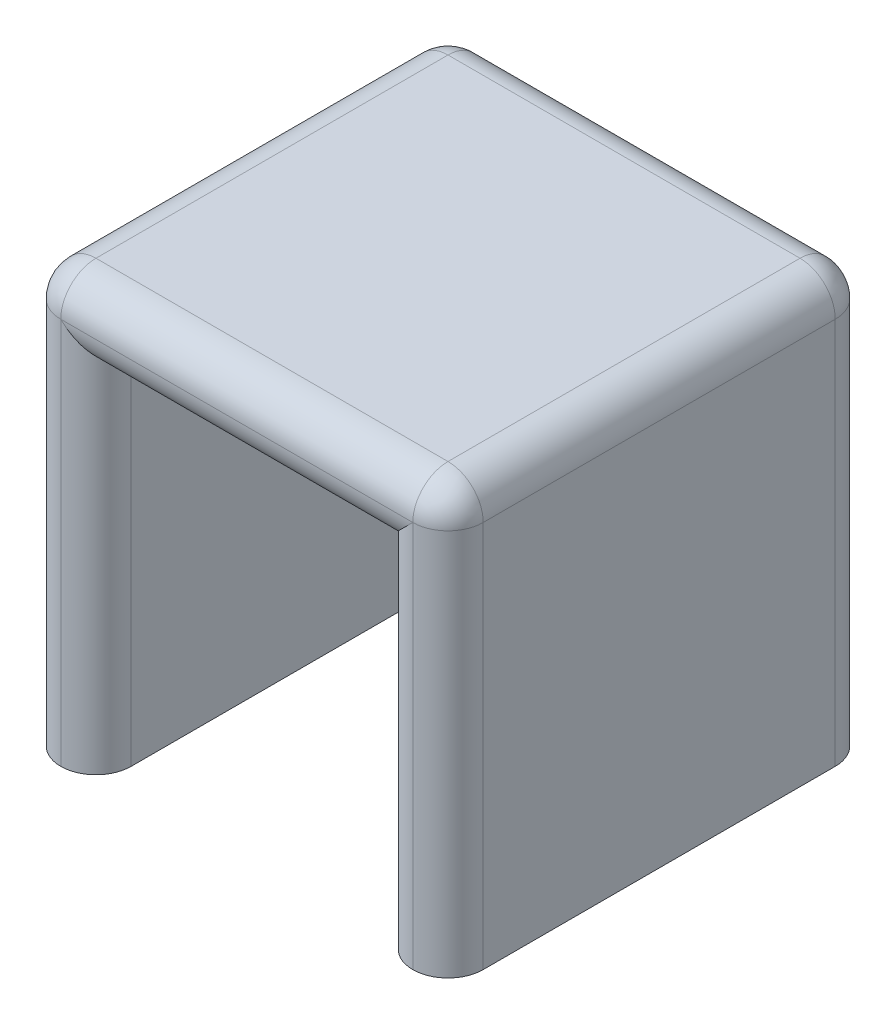
ISO-10303-21;
HEADER;
FILE_DESCRIPTION(('STEP AP214'),'2;1');
FILE_NAME('part.step','',(''),(''),'','','');
FILE_SCHEMA(('AUTOMOTIVE_DESIGN { 1 0 10303 214 1 1 1 1 }'));
ENDSEC;
DATA;
#1=APPLICATION_CONTEXT('core data for automotive mechanical design processes');
#2=APPLICATION_PROTOCOL_DEFINITION('international standard','automotive_design',2000,#1);
#3=PRODUCT_CONTEXT('',#1,'mechanical');
#4=PRODUCT('Part','Part','',(#3));
#5=PRODUCT_RELATED_PRODUCT_CATEGORY('part','',(#4));
#6=PRODUCT_DEFINITION_FORMATION('','',#4);
#7=PRODUCT_DEFINITION_CONTEXT('part definition',#1,'design');
#8=PRODUCT_DEFINITION('design','',#6,#7);
#9=PRODUCT_DEFINITION_SHAPE('','',#8);
#10=(LENGTH_UNIT() NAMED_UNIT(*) SI_UNIT(.MILLI.,.METRE.));
#11=(NAMED_UNIT(*) PLANE_ANGLE_UNIT() SI_UNIT($,.RADIAN.));
#12=(NAMED_UNIT(*) SI_UNIT($,.STERADIAN.) SOLID_ANGLE_UNIT());
#13=UNCERTAINTY_MEASURE_WITH_UNIT(LENGTH_MEASURE(1.E-05),#10,'distance_accuracy_value','');
#14=(GEOMETRIC_REPRESENTATION_CONTEXT(3) GLOBAL_UNCERTAINTY_ASSIGNED_CONTEXT((#13)) GLOBAL_UNIT_ASSIGNED_CONTEXT((#10,
#11,#12)) REPRESENTATION_CONTEXT('',''));
#15=CARTESIAN_POINT('',(0.,0.,0.));
#16=DIRECTION('',(0.,0.,1.));
#17=DIRECTION('',(1.,0.,0.));
#18=AXIS2_PLACEMENT_3D('',#15,#16,#17);
#19=CARTESIAN_POINT('',(2.,0.,12.));
#20=DIRECTION('',(0.,1.,0.));
#21=DIRECTION('',(0.,0.,1.));
#22=AXIS2_PLACEMENT_3D('',#19,#20,#21);
#23=PLANE('',#22);
#24=DIRECTION('',(0.,0.,-1.));
#25=VECTOR('',#24,1.);
#26=CARTESIAN_POINT('',(2.,0.,12.));
#27=LINE('',#26,#25);
#28=CARTESIAN_POINT('',(2.,0.,11.));
#29=VERTEX_POINT('',#28);
#30=CARTESIAN_POINT('',(2.,0.,1.));
#31=VERTEX_POINT('',#30);
#32=EDGE_CURVE('E276',#29,#31,#27,.T.);
#33=ORIENTED_EDGE('',*,*,#32,.F.);
#34=CARTESIAN_POINT('',(1.,0.,11.));
#35=DIRECTION('',(0.,1.,0.));
#36=DIRECTION('',(0.,0.,1.));
#37=AXIS2_PLACEMENT_3D('',#34,#35,#36);
#38=CIRCLE('',#37,1.);
#39=CARTESIAN_POINT('',(1.,0.,12.));
#40=VERTEX_POINT('',#39);
#41=EDGE_CURVE('E296',#29,#40,#38,.F.);
#42=ORIENTED_EDGE('',*,*,#41,.T.);
#43=CARTESIAN_POINT('',(1.,0.,11.));
#44=DIRECTION('',(0.,1.,0.));
#45=DIRECTION('',(0.,0.,1.));
#46=AXIS2_PLACEMENT_3D('',#43,#44,#45);
#47=CIRCLE('',#46,1.);
#48=CARTESIAN_POINT('',(0.,0.,11.));
#49=VERTEX_POINT('',#48);
#50=EDGE_CURVE('E293',#40,#49,#47,.F.);
#51=ORIENTED_EDGE('',*,*,#50,.T.);
#52=DIRECTION('',(0.,0.,-1.));
#53=VECTOR('',#52,1.);
#54=CARTESIAN_POINT('',(0.,0.,12.));
#55=LINE('',#54,#53);
#56=CARTESIAN_POINT('',(0.,0.,1.));
#57=VERTEX_POINT('',#56);
#58=EDGE_CURVE('E253',#49,#57,#55,.T.);
#59=ORIENTED_EDGE('',*,*,#58,.T.);
#60=CARTESIAN_POINT('',(1.,0.,1.));
#61=DIRECTION('',(0.,1.,0.));
#62=DIRECTION('',(0.,0.,1.));
#63=AXIS2_PLACEMENT_3D('',#60,#61,#62);
#64=CIRCLE('',#63,1.);
#65=CARTESIAN_POINT('',(1.,0.,0.));
#66=VERTEX_POINT('',#65);
#67=EDGE_CURVE('E290',#57,#66,#64,.F.);
#68=ORIENTED_EDGE('',*,*,#67,.T.);
#69=CARTESIAN_POINT('',(1.,0.,1.));
#70=DIRECTION('',(0.,1.,0.));
#71=DIRECTION('',(0.,0.,1.));
#72=AXIS2_PLACEMENT_3D('',#69,#70,#71);
#73=CIRCLE('',#72,1.);
#74=EDGE_CURVE('E287',#66,#31,#73,.F.);
#75=ORIENTED_EDGE('',*,*,#74,.T.);
#76=EDGE_LOOP('',(#33,#42,#51,#59,#68,#75));
#77=FACE_BOUND('',#76,.T.);
#78=ADVANCED_FACE('F39',(#77),#23,.F.);
#79=CARTESIAN_POINT('',(2.,10.,12.));
#80=DIRECTION('',(-1.,0.,0.));
#81=DIRECTION('',(0.,-1.,0.));
#82=AXIS2_PLACEMENT_3D('',#79,#80,#81);
#83=PLANE('',#82);
#84=DIRECTION('',(0.,0.,-1.));
#85=VECTOR('',#84,1.);
#86=CARTESIAN_POINT('',(2.,10.,12.));
#87=LINE('',#86,#85);
#88=CARTESIAN_POINT('',(2.,10.,11.));
#89=VERTEX_POINT('',#88);
#90=CARTESIAN_POINT('',(2.,10.,1.));
#91=VERTEX_POINT('',#90);
#92=EDGE_CURVE('E273',#89,#91,#87,.T.);
#93=ORIENTED_EDGE('',*,*,#92,.F.);
#94=DIRECTION('',(0.,1.,0.));
#95=VECTOR('',#94,1.);
#96=CARTESIAN_POINT('',(2.,10.,11.));
#97=LINE('',#96,#95);
#98=EDGE_CURVE('E283',#89,#29,#97,.F.);
#99=ORIENTED_EDGE('',*,*,#98,.T.);
#100=ORIENTED_EDGE('',*,*,#32,.T.);
#101=DIRECTION('',(0.,1.,0.));
#102=VECTOR('',#101,1.);
#103=CARTESIAN_POINT('',(2.,10.,1.));
#104=LINE('',#103,#102);
#105=EDGE_CURVE('E280',#31,#91,#104,.T.);
#106=ORIENTED_EDGE('',*,*,#105,.T.);
#107=EDGE_LOOP('',(#93,#99,#100,#106));
#108=FACE_BOUND('',#107,.T.);
#109=ADVANCED_FACE('F364',(#108),#83,.F.);
#110=CARTESIAN_POINT('',(10.,10.,12.));
#111=DIRECTION('',(0.,1.,0.));
#112=DIRECTION('',(-1.,0.,0.));
#113=AXIS2_PLACEMENT_3D('',#110,#111,#112);
#114=PLANE('',#113);
#115=DIRECTION('',(0.,0.,-1.));
#116=VECTOR('',#115,1.);
#117=CARTESIAN_POINT('',(10.,10.,12.));
#118=LINE('',#117,#116);
#119=CARTESIAN_POINT('',(10.,10.,11.));
#120=VERTEX_POINT('',#119);
#121=CARTESIAN_POINT('',(10.,10.,1.));
#122=VERTEX_POINT('',#121);
#123=EDGE_CURVE('E269',#120,#122,#118,.T.);
#124=ORIENTED_EDGE('',*,*,#123,.F.);
#125=DIRECTION('',(1.,0.,0.));
#126=VECTOR('',#125,1.);
#127=CARTESIAN_POINT('',(10.,10.,11.));
#128=LINE('',#127,#126);
#129=EDGE_CURVE('E91',#120,#89,#128,.F.);
#130=ORIENTED_EDGE('',*,*,#129,.T.);
#131=ORIENTED_EDGE('',*,*,#92,.T.);
#132=DIRECTION('',(1.,0.,0.));
#133=VECTOR('',#132,1.);
#134=CARTESIAN_POINT('',(10.,10.,1.));
#135=LINE('',#134,#133);
#136=EDGE_CURVE('E335',#91,#122,#135,.T.);
#137=ORIENTED_EDGE('',*,*,#136,.T.);
#138=EDGE_LOOP('',(#124,#130,#131,#137));
#139=FACE_BOUND('',#138,.T.);
#140=ADVANCED_FACE('F339',(#139),#114,.F.);
#141=CARTESIAN_POINT('',(10.,0.,12.));
#142=DIRECTION('',(1.,0.,0.));
#143=DIRECTION('',(0.,0.,-1.));
#144=AXIS2_PLACEMENT_3D('',#141,#142,#143);
#145=PLANE('',#144);
#146=DIRECTION('',(0.,0.,-1.));
#147=VECTOR('',#146,1.);
#148=CARTESIAN_POINT('',(10.,0.,12.));
#149=LINE('',#148,#147);
#150=CARTESIAN_POINT('',(10.,0.,11.));
#151=VERTEX_POINT('',#150);
#152=CARTESIAN_POINT('',(10.,0.,1.));
#153=VERTEX_POINT('',#152);
#154=EDGE_CURVE('E263',#151,#153,#149,.T.);
#155=ORIENTED_EDGE('',*,*,#154,.F.);
#156=DIRECTION('',(0.,-1.,0.));
#157=VECTOR('',#156,1.);
#158=CARTESIAN_POINT('',(10.,0.,11.));
#159=LINE('',#158,#157);
#160=EDGE_CURVE('E332',#151,#120,#159,.F.);
#161=ORIENTED_EDGE('',*,*,#160,.T.);
#162=ORIENTED_EDGE('',*,*,#123,.T.);
#163=DIRECTION('',(0.,-1.,0.));
#164=VECTOR('',#163,1.);
#165=CARTESIAN_POINT('',(10.,0.,1.));
#166=LINE('',#165,#164);
#167=EDGE_CURVE('E329',#122,#153,#166,.T.);
#168=ORIENTED_EDGE('',*,*,#167,.T.);
#169=EDGE_LOOP('',(#155,#161,#162,#168));
#170=FACE_BOUND('',#169,.T.);
#171=ADVANCED_FACE('F343',(#170),#145,.F.);
#172=CARTESIAN_POINT('',(12.,0.,12.));
#173=DIRECTION('',(0.,1.,0.));
#174=DIRECTION('',(-1.,0.,0.));
#175=AXIS2_PLACEMENT_3D('',#172,#173,#174);
#176=PLANE('',#175);
#177=DIRECTION('',(0.,0.,-1.));
#178=VECTOR('',#177,1.);
#179=CARTESIAN_POINT('',(12.,0.,12.));
#180=LINE('',#179,#178);
#181=CARTESIAN_POINT('',(12.,0.,11.));
#182=VERTEX_POINT('',#181);
#183=CARTESIAN_POINT('',(12.,0.,1.));
#184=VERTEX_POINT('',#183);
#185=EDGE_CURVE('E256',#182,#184,#180,.T.);
#186=ORIENTED_EDGE('',*,*,#185,.F.);
#187=CARTESIAN_POINT('',(11.,0.,11.));
#188=DIRECTION('',(0.,1.,0.));
#189=DIRECTION('',(-1.,0.,0.));
#190=AXIS2_PLACEMENT_3D('',#187,#188,#189);
#191=CIRCLE('',#190,1.);
#192=CARTESIAN_POINT('',(11.,0.,12.));
#193=VERTEX_POINT('',#192);
#194=EDGE_CURVE('E326',#182,#193,#191,.F.);
#195=ORIENTED_EDGE('',*,*,#194,.T.);
#196=CARTESIAN_POINT('',(11.,0.,11.));
#197=DIRECTION('',(0.,1.,0.));
#198=DIRECTION('',(-1.,0.,0.));
#199=AXIS2_PLACEMENT_3D('',#196,#197,#198);
#200=CIRCLE('',#199,1.);
#201=EDGE_CURVE('E323',#193,#151,#200,.F.);
#202=ORIENTED_EDGE('',*,*,#201,.T.);
#203=ORIENTED_EDGE('',*,*,#154,.T.);
#204=CARTESIAN_POINT('',(11.,0.,1.));
#205=DIRECTION('',(0.,1.,0.));
#206=DIRECTION('',(-1.,0.,0.));
#207=AXIS2_PLACEMENT_3D('',#204,#205,#206);
#208=CIRCLE('',#207,1.);
#209=CARTESIAN_POINT('',(11.,0.,0.));
#210=VERTEX_POINT('',#209);
#211=EDGE_CURVE('E317',#153,#210,#208,.F.);
#212=ORIENTED_EDGE('',*,*,#211,.T.);
#213=CARTESIAN_POINT('',(11.,0.,1.));
#214=DIRECTION('',(0.,1.,0.));
#215=DIRECTION('',(-1.,0.,0.));
#216=AXIS2_PLACEMENT_3D('',#213,#214,#215);
#217=CIRCLE('',#216,1.);
#218=EDGE_CURVE('E320',#210,#184,#217,.F.);
#219=ORIENTED_EDGE('',*,*,#218,.T.);
#220=EDGE_LOOP('',(#186,#195,#202,#203,#212,#219));
#221=FACE_BOUND('',#220,.T.);
#222=ADVANCED_FACE('F349',(#221),#176,.F.);
#223=CARTESIAN_POINT('',(12.,12.,12.));
#224=DIRECTION('',(-1.,0.,0.));
#225=DIRECTION('',(0.,0.,1.));
#226=AXIS2_PLACEMENT_3D('',#223,#224,#225);
#227=PLANE('',#226);
#228=DIRECTION('',(0.,0.,-1.));
#229=VECTOR('',#228,1.);
#230=CARTESIAN_POINT('',(12.,11.,12.));
#231=LINE('',#230,#229);
#232=CARTESIAN_POINT('',(12.,11.,1.));
#233=VERTEX_POINT('',#232);
#234=CARTESIAN_POINT('',(12.,11.,11.));
#235=VERTEX_POINT('',#234);
#236=EDGE_CURVE('E311',#233,#235,#231,.F.);
#237=ORIENTED_EDGE('',*,*,#236,.T.);
#238=DIRECTION('',(0.,1.,0.));
#239=VECTOR('',#238,1.);
#240=CARTESIAN_POINT('',(12.,12.,11.));
#241=LINE('',#240,#239);
#242=EDGE_CURVE('E314',#235,#182,#241,.F.);
#243=ORIENTED_EDGE('',*,*,#242,.T.);
#244=ORIENTED_EDGE('',*,*,#185,.T.);
#245=DIRECTION('',(0.,1.,0.));
#246=VECTOR('',#245,1.);
#247=CARTESIAN_POINT('',(12.,12.,1.));
#248=LINE('',#247,#246);
#249=EDGE_CURVE('E308',#184,#233,#248,.T.);
#250=ORIENTED_EDGE('',*,*,#249,.T.);
#251=EDGE_LOOP('',(#237,#243,#244,#250));
#252=FACE_BOUND('',#251,.T.);
#253=ADVANCED_FACE('F555',(#252),#227,.F.);
#254=CARTESIAN_POINT('',(0.,12.,12.));
#255=DIRECTION('',(0.,-1.,0.));
#256=DIRECTION('',(0.,0.,-1.));
#257=AXIS2_PLACEMENT_3D('',#254,#255,#256);
#258=PLANE('',#257);
#259=DIRECTION('',(0.,0.,-1.));
#260=VECTOR('',#259,1.);
#261=CARTESIAN_POINT('',(1.,12.,12.));
#262=LINE('',#261,#260);
#263=CARTESIAN_POINT('',(1.,12.,1.));
#264=VERTEX_POINT('',#263);
#265=CARTESIAN_POINT('',(1.,12.,11.));
#266=VERTEX_POINT('',#265);
#267=EDGE_CURVE('E50',#264,#266,#262,.F.);
#268=ORIENTED_EDGE('',*,*,#267,.T.);
#269=DIRECTION('',(-1.,0.,0.));
#270=VECTOR('',#269,1.);
#271=CARTESIAN_POINT('',(0.,12.,11.));
#272=LINE('',#271,#270);
#273=CARTESIAN_POINT('',(11.,12.,11.));
#274=VERTEX_POINT('',#273);
#275=EDGE_CURVE('E11',#266,#274,#272,.F.);
#276=ORIENTED_EDGE('',*,*,#275,.T.);
#277=DIRECTION('',(0.,0.,-1.));
#278=VECTOR('',#277,1.);
#279=CARTESIAN_POINT('',(11.,12.,12.));
#280=LINE('',#279,#278);
#281=CARTESIAN_POINT('',(11.,12.,1.));
#282=VERTEX_POINT('',#281);
#283=EDGE_CURVE('E157',#274,#282,#280,.T.);
#284=ORIENTED_EDGE('',*,*,#283,.T.);
#285=DIRECTION('',(-1.,0.,0.));
#286=VECTOR('',#285,1.);
#287=CARTESIAN_POINT('',(0.,12.,1.));
#288=LINE('',#287,#286);
#289=EDGE_CURVE('E153',#282,#264,#288,.T.);
#290=ORIENTED_EDGE('',*,*,#289,.T.);
#291=EDGE_LOOP('',(#268,#276,#284,#290));
#292=FACE_BOUND('',#291,.T.);
#293=ADVANCED_FACE('F155',(#292),#258,.F.);
#294=CARTESIAN_POINT('',(0.,0.,12.));
#295=DIRECTION('',(1.,0.,0.));
#296=DIRECTION('',(0.,0.,-1.));
#297=AXIS2_PLACEMENT_3D('',#294,#295,#296);
#298=PLANE('',#297);
#299=ORIENTED_EDGE('',*,*,#58,.F.);
#300=DIRECTION('',(0.,-1.,0.));
#301=VECTOR('',#300,1.);
#302=CARTESIAN_POINT('',(0.,0.,11.));
#303=LINE('',#302,#301);
#304=CARTESIAN_POINT('',(0.,11.,11.));
#305=VERTEX_POINT('',#304);
#306=EDGE_CURVE('E305',#49,#305,#303,.F.);
#307=ORIENTED_EDGE('',*,*,#306,.T.);
#308=DIRECTION('',(0.,0.,-1.));
#309=VECTOR('',#308,1.);
#310=CARTESIAN_POINT('',(0.,11.,12.));
#311=LINE('',#310,#309);
#312=CARTESIAN_POINT('',(0.,11.,1.));
#313=VERTEX_POINT('',#312);
#314=EDGE_CURVE('E302',#305,#313,#311,.T.);
#315=ORIENTED_EDGE('',*,*,#314,.T.);
#316=DIRECTION('',(0.,-1.,0.));
#317=VECTOR('',#316,1.);
#318=CARTESIAN_POINT('',(0.,0.,1.));
#319=LINE('',#318,#317);
#320=EDGE_CURVE('E299',#313,#57,#319,.T.);
#321=ORIENTED_EDGE('',*,*,#320,.T.);
#322=EDGE_LOOP('',(#299,#307,#315,#321));
#323=FACE_BOUND('',#322,.T.);
#324=ADVANCED_FACE('F374',(#323),#298,.F.);
#325=CARTESIAN_POINT('',(11.,0.,1.));
#326=DIRECTION('',(0.,1.,0.));
#327=DIRECTION('',(0.,0.,1.));
#328=AXIS2_PLACEMENT_3D('',#325,#326,#327);
#329=CYLINDRICAL_SURFACE('',#328,1.);
#330=ORIENTED_EDGE('',*,*,#211,.F.);
#331=ORIENTED_EDGE('',*,*,#167,.F.);
#332=CARTESIAN_POINT('',(11.,11.,1.));
#333=DIRECTION('',(-0.707106781186548,0.707106781186547,0.));
#334=DIRECTION('',(0.707106781186547,0.707106781186548,0.));
#335=AXIS2_PLACEMENT_3D('',#332,#333,#334);
#336=ELLIPSE('',#335,1.4142135623731,1.);
#337=CARTESIAN_POINT('',(11.,11.,0.));
#338=VERTEX_POINT('',#337);
#339=EDGE_CURVE('E82',#338,#122,#336,.T.);
#340=ORIENTED_EDGE('',*,*,#339,.F.);
#341=DIRECTION('',(0.,-1.,0.));
#342=VECTOR('',#341,1.);
#343=CARTESIAN_POINT('',(11.,10.,0.));
#344=LINE('',#343,#342);
#345=EDGE_CURVE('E249',#210,#338,#344,.F.);
#346=ORIENTED_EDGE('',*,*,#345,.F.);
#347=EDGE_LOOP('',(#330,#331,#340,#346));
#348=FACE_BOUND('',#347,.T.);
#349=ADVANCED_FACE('F41',(#348),#329,.T.);
#350=CARTESIAN_POINT('',(1.,10.,1.));
#351=DIRECTION('',(0.,-1.,0.));
#352=DIRECTION('',(1.,0.,0.));
#353=AXIS2_PLACEMENT_3D('',#350,#351,#352);
#354=CYLINDRICAL_SURFACE('',#353,1.);
#355=CARTESIAN_POINT('',(1.,11.,1.));
#356=DIRECTION('',(-0.707106781186547,-0.707106781186548,0.));
#357=DIRECTION('',(-0.707106781186548,0.707106781186547,0.));
#358=AXIS2_PLACEMENT_3D('',#355,#356,#357);
#359=ELLIPSE('',#358,1.41421356237309,1.);
#360=CARTESIAN_POINT('',(1.,11.,0.));
#361=VERTEX_POINT('',#360);
#362=EDGE_CURVE('E43',#91,#361,#359,.F.);
#363=ORIENTED_EDGE('',*,*,#362,.F.);
#364=ORIENTED_EDGE('',*,*,#105,.F.);
#365=ORIENTED_EDGE('',*,*,#74,.F.);
#366=DIRECTION('',(0.,1.,0.));
#367=VECTOR('',#366,1.);
#368=CARTESIAN_POINT('',(1.,0.,0.));
#369=LINE('',#368,#367);
#370=EDGE_CURVE('E245',#361,#66,#369,.F.);
#371=ORIENTED_EDGE('',*,*,#370,.F.);
#372=EDGE_LOOP('',(#363,#364,#365,#371));
#373=FACE_BOUND('',#372,.T.);
#374=ADVANCED_FACE('F369',(#373),#354,.T.);
#375=CARTESIAN_POINT('',(10.,11.,1.));
#376=DIRECTION('',(-1.,0.,0.));
#377=DIRECTION('',(0.,-1.,0.));
#378=AXIS2_PLACEMENT_3D('',#375,#376,#377);
#379=CYLINDRICAL_SURFACE('',#378,1.);
#380=ORIENTED_EDGE('',*,*,#136,.F.);
#381=ORIENTED_EDGE('',*,*,#362,.T.);
#382=DIRECTION('',(1.,0.,0.));
#383=VECTOR('',#382,1.);
#384=CARTESIAN_POINT('',(2.,11.,0.));
#385=LINE('',#384,#383);
#386=EDGE_CURVE('E168',#338,#361,#385,.F.);
#387=ORIENTED_EDGE('',*,*,#386,.F.);
#388=ORIENTED_EDGE('',*,*,#339,.T.);
#389=EDGE_LOOP('',(#380,#381,#387,#388));
#390=FACE_BOUND('',#389,.T.);
#391=ADVANCED_FACE('F515',(#390),#379,.T.);
#392=CARTESIAN_POINT('',(11.,12.,1.));
#393=DIRECTION('',(0.,-1.,0.));
#394=DIRECTION('',(0.,0.,-1.));
#395=AXIS2_PLACEMENT_3D('',#392,#393,#394);
#396=CYLINDRICAL_SURFACE('',#395,1.);
#397=ORIENTED_EDGE('',*,*,#218,.F.);
#398=ORIENTED_EDGE('',*,*,#345,.T.);
#399=CARTESIAN_POINT('',(11.,11.,1.));
#400=DIRECTION('',(0.,1.,0.));
#401=DIRECTION('',(0.,0.,1.));
#402=AXIS2_PLACEMENT_3D('',#399,#400,#401);
#403=CIRCLE('',#402,1.);
#404=EDGE_CURVE('E236',#233,#338,#403,.T.);
#405=ORIENTED_EDGE('',*,*,#404,.F.);
#406=ORIENTED_EDGE('',*,*,#249,.F.);
#407=EDGE_LOOP('',(#397,#398,#405,#406));
#408=FACE_BOUND('',#407,.T.);
#409=ADVANCED_FACE('F506',(#408),#396,.T.);
#410=CARTESIAN_POINT('',(1.,0.,1.));
#411=DIRECTION('',(0.,1.,0.));
#412=DIRECTION('',(0.,0.,1.));
#413=AXIS2_PLACEMENT_3D('',#410,#411,#412);
#414=CYLINDRICAL_SURFACE('',#413,1.);
#415=ORIENTED_EDGE('',*,*,#67,.F.);
#416=ORIENTED_EDGE('',*,*,#320,.F.);
#417=CARTESIAN_POINT('',(1.,11.,1.));
#418=DIRECTION('',(0.,1.,0.));
#419=DIRECTION('',(0.,0.,1.));
#420=AXIS2_PLACEMENT_3D('',#417,#418,#419);
#421=CIRCLE('',#420,1.);
#422=EDGE_CURVE('E173',#361,#313,#421,.T.);
#423=ORIENTED_EDGE('',*,*,#422,.F.);
#424=ORIENTED_EDGE('',*,*,#370,.T.);
#425=EDGE_LOOP('',(#415,#416,#423,#424));
#426=FACE_BOUND('',#425,.T.);
#427=ADVANCED_FACE('F371',(#426),#414,.T.);
#428=CARTESIAN_POINT('',(0.,11.,1.));
#429=DIRECTION('',(1.,0.,0.));
#430=DIRECTION('',(0.,0.,-1.));
#431=AXIS2_PLACEMENT_3D('',#428,#429,#430);
#432=CYLINDRICAL_SURFACE('',#431,1.);
#433=CARTESIAN_POINT('',(11.,11.,1.));
#434=DIRECTION('',(1.,0.,0.));
#435=DIRECTION('',(0.,0.,-1.));
#436=AXIS2_PLACEMENT_3D('',#433,#434,#435);
#437=CIRCLE('',#436,1.);
#438=EDGE_CURVE('E240',#338,#282,#437,.T.);
#439=ORIENTED_EDGE('',*,*,#438,.F.);
#440=ORIENTED_EDGE('',*,*,#386,.T.);
#441=CARTESIAN_POINT('',(1.,11.,1.));
#442=DIRECTION('',(-1.,0.,0.));
#443=DIRECTION('',(0.,0.,1.));
#444=AXIS2_PLACEMENT_3D('',#441,#442,#443);
#445=CIRCLE('',#444,1.);
#446=EDGE_CURVE('E165',#264,#361,#445,.T.);
#447=ORIENTED_EDGE('',*,*,#446,.F.);
#448=ORIENTED_EDGE('',*,*,#289,.F.);
#449=EDGE_LOOP('',(#439,#440,#447,#448));
#450=FACE_BOUND('',#449,.T.);
#451=ADVANCED_FACE('F167',(#450),#432,.T.);
#452=CARTESIAN_POINT('',(11.,11.,1.));
#453=DIRECTION('',(0.,0.,1.));
#454=DIRECTION('',(1.,0.,0.));
#455=AXIS2_PLACEMENT_3D('',#452,#453,#454);
#456=SPHERICAL_SURFACE('',#455,1.);
#457=ORIENTED_EDGE('',*,*,#404,.T.);
#458=ORIENTED_EDGE('',*,*,#438,.T.);
#459=CARTESIAN_POINT('',(11.,11.,1.));
#460=DIRECTION('',(0.,0.,-1.));
#461=DIRECTION('',(-1.,0.,0.));
#462=AXIS2_PLACEMENT_3D('',#459,#460,#461);
#463=CIRCLE('',#462,1.);
#464=EDGE_CURVE('E174',#233,#282,#463,.F.);
#465=ORIENTED_EDGE('',*,*,#464,.F.);
#466=EDGE_LOOP('',(#457,#458,#465));
#467=FACE_BOUND('',#466,.T.);
#468=ADVANCED_FACE('F480',(#467),#456,.T.);
#469=CARTESIAN_POINT('',(1.,11.,1.));
#470=DIRECTION('',(0.,0.,1.));
#471=DIRECTION('',(1.,0.,0.));
#472=AXIS2_PLACEMENT_3D('',#469,#470,#471);
#473=SPHERICAL_SURFACE('',#472,1.);
#474=ORIENTED_EDGE('',*,*,#446,.T.);
#475=ORIENTED_EDGE('',*,*,#422,.T.);
#476=CARTESIAN_POINT('',(1.,11.,1.));
#477=DIRECTION('',(0.,0.,-1.));
#478=DIRECTION('',(-1.,0.,0.));
#479=AXIS2_PLACEMENT_3D('',#476,#477,#478);
#480=CIRCLE('',#479,1.);
#481=EDGE_CURVE('E177',#264,#313,#480,.F.);
#482=ORIENTED_EDGE('',*,*,#481,.F.);
#483=EDGE_LOOP('',(#474,#475,#482));
#484=FACE_BOUND('',#483,.T.);
#485=ADVANCED_FACE('F178',(#484),#473,.T.);
#486=CARTESIAN_POINT('',(11.,11.,12.));
#487=DIRECTION('',(0.,0.,-1.));
#488=DIRECTION('',(-1.,0.,0.));
#489=AXIS2_PLACEMENT_3D('',#486,#487,#488);
#490=CYLINDRICAL_SURFACE('',#489,1.);
#491=ORIENTED_EDGE('',*,*,#464,.T.);
#492=ORIENTED_EDGE('',*,*,#283,.F.);
#493=CARTESIAN_POINT('',(11.,11.,11.));
#494=DIRECTION('',(0.,0.,1.));
#495=DIRECTION('',(1.,0.,0.));
#496=AXIS2_PLACEMENT_3D('',#493,#494,#495);
#497=CIRCLE('',#496,1.);
#498=EDGE_CURVE('E182',#235,#274,#497,.T.);
#499=ORIENTED_EDGE('',*,*,#498,.F.);
#500=ORIENTED_EDGE('',*,*,#236,.F.);
#501=EDGE_LOOP('',(#491,#492,#499,#500));
#502=FACE_BOUND('',#501,.T.);
#503=ADVANCED_FACE('F462',(#502),#490,.T.);
#504=CARTESIAN_POINT('',(1.,11.,12.));
#505=DIRECTION('',(0.,0.,-1.));
#506=DIRECTION('',(-1.,0.,0.));
#507=AXIS2_PLACEMENT_3D('',#504,#505,#506);
#508=CYLINDRICAL_SURFACE('',#507,1.);
#509=ORIENTED_EDGE('',*,*,#481,.T.);
#510=ORIENTED_EDGE('',*,*,#314,.F.);
#511=CARTESIAN_POINT('',(1.,11.,11.));
#512=DIRECTION('',(0.,0.,1.));
#513=DIRECTION('',(1.,0.,0.));
#514=AXIS2_PLACEMENT_3D('',#511,#512,#513);
#515=CIRCLE('',#514,1.);
#516=EDGE_CURVE('E186',#266,#305,#515,.T.);
#517=ORIENTED_EDGE('',*,*,#516,.F.);
#518=ORIENTED_EDGE('',*,*,#267,.F.);
#519=EDGE_LOOP('',(#509,#510,#517,#518));
#520=FACE_BOUND('',#519,.T.);
#521=ADVANCED_FACE('F184',(#520),#508,.T.);
#522=CARTESIAN_POINT('',(11.,11.,11.));
#523=DIRECTION('',(0.,0.,1.));
#524=DIRECTION('',(1.,0.,0.));
#525=AXIS2_PLACEMENT_3D('',#522,#523,#524);
#526=SPHERICAL_SURFACE('',#525,1.);
#527=CARTESIAN_POINT('',(11.,11.,11.));
#528=DIRECTION('',(0.,1.,0.));
#529=DIRECTION('',(0.,0.,1.));
#530=AXIS2_PLACEMENT_3D('',#527,#528,#529);
#531=CIRCLE('',#530,1.);
#532=CARTESIAN_POINT('',(11.,11.,12.));
#533=VERTEX_POINT('',#532);
#534=EDGE_CURVE('E225',#235,#533,#531,.F.);
#535=ORIENTED_EDGE('',*,*,#534,.F.);
#536=ORIENTED_EDGE('',*,*,#498,.T.);
#537=CARTESIAN_POINT('',(11.,11.,11.));
#538=DIRECTION('',(1.,0.,0.));
#539=DIRECTION('',(0.,0.,-1.));
#540=AXIS2_PLACEMENT_3D('',#537,#538,#539);
#541=CIRCLE('',#540,1.);
#542=EDGE_CURVE('E217',#533,#274,#541,.F.);
#543=ORIENTED_EDGE('',*,*,#542,.F.);
#544=EDGE_LOOP('',(#535,#536,#543));
#545=FACE_BOUND('',#544,.T.);
#546=ADVANCED_FACE('F443',(#545),#526,.T.);
#547=CARTESIAN_POINT('',(11.,0.,11.));
#548=DIRECTION('',(0.,1.,0.));
#549=DIRECTION('',(0.,0.,1.));
#550=AXIS2_PLACEMENT_3D('',#547,#548,#549);
#551=CYLINDRICAL_SURFACE('',#550,1.);
#552=ORIENTED_EDGE('',*,*,#242,.F.);
#553=ORIENTED_EDGE('',*,*,#534,.T.);
#554=DIRECTION('',(0.,1.,0.));
#555=VECTOR('',#554,1.);
#556=CARTESIAN_POINT('',(11.,0.,12.));
#557=LINE('',#556,#555);
#558=EDGE_CURVE('E213',#193,#533,#557,.T.);
#559=ORIENTED_EDGE('',*,*,#558,.F.);
#560=ORIENTED_EDGE('',*,*,#194,.F.);
#561=EDGE_LOOP('',(#552,#553,#559,#560));
#562=FACE_BOUND('',#561,.T.);
#563=ADVANCED_FACE('F434',(#562),#551,.T.);
#564=CARTESIAN_POINT('',(1.,11.,11.));
#565=DIRECTION('',(0.,0.,1.));
#566=DIRECTION('',(1.,0.,0.));
#567=AXIS2_PLACEMENT_3D('',#564,#565,#566);
#568=SPHERICAL_SURFACE('',#567,1.);
#569=CARTESIAN_POINT('',(1.,11.,11.));
#570=DIRECTION('',(-1.,0.,0.));
#571=DIRECTION('',(0.,0.,1.));
#572=AXIS2_PLACEMENT_3D('',#569,#570,#571);
#573=CIRCLE('',#572,1.);
#574=CARTESIAN_POINT('',(1.,11.,12.));
#575=VERTEX_POINT('',#574);
#576=EDGE_CURVE('E220',#266,#575,#573,.F.);
#577=ORIENTED_EDGE('',*,*,#576,.F.);
#578=ORIENTED_EDGE('',*,*,#516,.T.);
#579=CARTESIAN_POINT('',(1.,11.,11.));
#580=DIRECTION('',(0.,1.,0.));
#581=DIRECTION('',(0.,0.,1.));
#582=AXIS2_PLACEMENT_3D('',#579,#580,#581);
#583=CIRCLE('',#582,1.);
#584=EDGE_CURVE('E209',#575,#305,#583,.F.);
#585=ORIENTED_EDGE('',*,*,#584,.F.);
#586=EDGE_LOOP('',(#577,#578,#585));
#587=FACE_BOUND('',#586,.T.);
#588=ADVANCED_FACE('F378',(#587),#568,.T.);
#589=CARTESIAN_POINT('',(0.,11.,11.));
#590=DIRECTION('',(-1.,0.,0.));
#591=DIRECTION('',(0.,0.,1.));
#592=AXIS2_PLACEMENT_3D('',#589,#590,#591);
#593=CYLINDRICAL_SURFACE('',#592,1.);
#594=ORIENTED_EDGE('',*,*,#275,.F.);
#595=ORIENTED_EDGE('',*,*,#576,.T.);
#596=DIRECTION('',(-1.,0.,0.));
#597=VECTOR('',#596,1.);
#598=CARTESIAN_POINT('',(0.,11.,12.));
#599=LINE('',#598,#597);
#600=EDGE_CURVE('E205',#533,#575,#599,.T.);
#601=ORIENTED_EDGE('',*,*,#600,.F.);
#602=ORIENTED_EDGE('',*,*,#542,.T.);
#603=EDGE_LOOP('',(#594,#595,#601,#602));
#604=FACE_BOUND('',#603,.T.);
#605=ADVANCED_FACE('F389',(#604),#593,.T.);
#606=CARTESIAN_POINT('',(11.,0.,11.));
#607=DIRECTION('',(0.,-1.,0.));
#608=DIRECTION('',(0.,0.,-1.));
#609=AXIS2_PLACEMENT_3D('',#606,#607,#608);
#610=CYLINDRICAL_SURFACE('',#609,1.);
#611=ORIENTED_EDGE('',*,*,#201,.F.);
#612=ORIENTED_EDGE('',*,*,#558,.T.);
#613=CARTESIAN_POINT('',(11.,11.,11.));
#614=DIRECTION('',(0.707106781186548,-0.707106781186547,0.));
#615=DIRECTION('',(-0.707106781186547,-0.707106781186548,0.));
#616=AXIS2_PLACEMENT_3D('',#613,#614,#615);
#617=ELLIPSE('',#616,1.4142135623731,1.);
#618=EDGE_CURVE('E201',#120,#533,#617,.F.);
#619=ORIENTED_EDGE('',*,*,#618,.F.);
#620=ORIENTED_EDGE('',*,*,#160,.F.);
#621=EDGE_LOOP('',(#611,#612,#619,#620));
#622=FACE_BOUND('',#621,.T.);
#623=ADVANCED_FACE('F352',(#622),#610,.T.);
#624=CARTESIAN_POINT('',(1.,0.,11.));
#625=DIRECTION('',(0.,-1.,0.));
#626=DIRECTION('',(0.,0.,-1.));
#627=AXIS2_PLACEMENT_3D('',#624,#625,#626);
#628=CYLINDRICAL_SURFACE('',#627,1.);
#629=ORIENTED_EDGE('',*,*,#306,.F.);
#630=ORIENTED_EDGE('',*,*,#50,.F.);
#631=DIRECTION('',(0.,-1.,0.));
#632=VECTOR('',#631,1.);
#633=CARTESIAN_POINT('',(1.,0.,12.));
#634=LINE('',#633,#632);
#635=EDGE_CURVE('E197',#575,#40,#634,.T.);
#636=ORIENTED_EDGE('',*,*,#635,.F.);
#637=ORIENTED_EDGE('',*,*,#584,.T.);
#638=EDGE_LOOP('',(#629,#630,#636,#637));
#639=FACE_BOUND('',#638,.T.);
#640=ADVANCED_FACE('F381',(#639),#628,.T.);
#641=CARTESIAN_POINT('',(0.,11.,11.));
#642=DIRECTION('',(1.,0.,0.));
#643=DIRECTION('',(0.,1.,0.));
#644=AXIS2_PLACEMENT_3D('',#641,#642,#643);
#645=CYLINDRICAL_SURFACE('',#644,1.);
#646=ORIENTED_EDGE('',*,*,#618,.T.);
#647=ORIENTED_EDGE('',*,*,#600,.T.);
#648=CARTESIAN_POINT('',(1.,11.,11.));
#649=DIRECTION('',(0.707106781186547,0.707106781186548,0.));
#650=DIRECTION('',(-0.707106781186548,0.707106781186547,0.));
#651=AXIS2_PLACEMENT_3D('',#648,#649,#650);
#652=ELLIPSE('',#651,1.41421356237309,1.);
#653=EDGE_CURVE('E193',#89,#575,#652,.F.);
#654=ORIENTED_EDGE('',*,*,#653,.F.);
#655=ORIENTED_EDGE('',*,*,#129,.F.);
#656=EDGE_LOOP('',(#646,#647,#654,#655));
#657=FACE_BOUND('',#656,.T.);
#658=ADVANCED_FACE('F357',(#657),#645,.T.);
#659=CARTESIAN_POINT('',(1.,0.,11.));
#660=DIRECTION('',(0.,1.,0.));
#661=DIRECTION('',(-1.,0.,0.));
#662=AXIS2_PLACEMENT_3D('',#659,#660,#661);
#663=CYLINDRICAL_SURFACE('',#662,1.);
#664=ORIENTED_EDGE('',*,*,#41,.F.);
#665=ORIENTED_EDGE('',*,*,#98,.F.);
#666=ORIENTED_EDGE('',*,*,#653,.T.);
#667=ORIENTED_EDGE('',*,*,#635,.T.);
#668=EDGE_LOOP('',(#664,#665,#666,#667));
#669=FACE_BOUND('',#668,.T.);
#670=ADVANCED_FACE('F361',(#669),#663,.T.);
#671=CLOSED_SHELL('',(#78,#109,#140,#171,#222,#253,#293,#324,#349,#374,#391,#409,#427,#451,#468,
#485,#503,#521,#546,#563,#588,#605,#623,#640,#658,#670));
#672=MANIFOLD_SOLID_BREP('B2',#671);
#673=ADVANCED_BREP_SHAPE_REPRESENTATION('',(#18,#672),#14);
#674=SHAPE_DEFINITION_REPRESENTATION(#9,#673);
ENDSEC;
END-ISO-10303-21;
